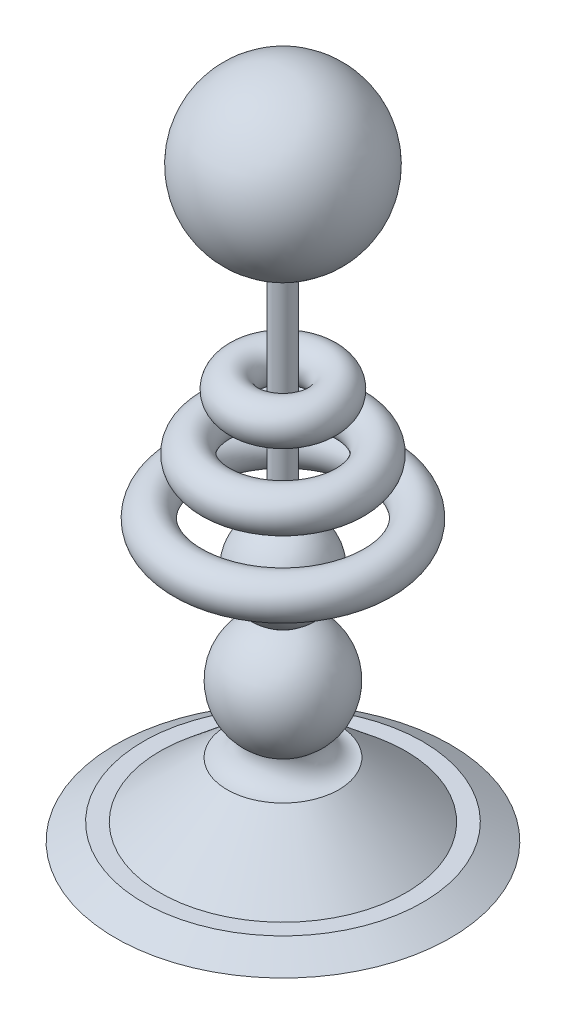
ISO-10303-21;
HEADER;
FILE_DESCRIPTION(('STEP AP214'),'2;1');
FILE_NAME('part.step','',(''),(''),'','','');
FILE_SCHEMA(('AUTOMOTIVE_DESIGN { 1 0 10303 214 1 1 1 1 }'));
ENDSEC;
DATA;
#1=APPLICATION_CONTEXT('core data for automotive mechanical design processes');
#2=APPLICATION_PROTOCOL_DEFINITION('international standard','automotive_design',2000,#1);
#3=PRODUCT_CONTEXT('',#1,'mechanical');
#4=PRODUCT('Part','Part','',(#3));
#5=PRODUCT_RELATED_PRODUCT_CATEGORY('part','',(#4));
#6=PRODUCT_DEFINITION_FORMATION('','',#4);
#7=PRODUCT_DEFINITION_CONTEXT('part definition',#1,'design');
#8=PRODUCT_DEFINITION('design','',#6,#7);
#9=PRODUCT_DEFINITION_SHAPE('','',#8);
#10=(LENGTH_UNIT() NAMED_UNIT(*) SI_UNIT(.MILLI.,.METRE.));
#11=(NAMED_UNIT(*) PLANE_ANGLE_UNIT() SI_UNIT($,.RADIAN.));
#12=(NAMED_UNIT(*) SI_UNIT($,.STERADIAN.) SOLID_ANGLE_UNIT());
#13=UNCERTAINTY_MEASURE_WITH_UNIT(LENGTH_MEASURE(1.E-05),#10,'distance_accuracy_value','');
#14=(GEOMETRIC_REPRESENTATION_CONTEXT(3) GLOBAL_UNCERTAINTY_ASSIGNED_CONTEXT((#13)) GLOBAL_UNIT_ASSIGNED_CONTEXT((#10,
#11,#12)) REPRESENTATION_CONTEXT('',''));
#15=CARTESIAN_POINT('',(0.,0.,0.));
#16=DIRECTION('',(0.,0.,1.));
#17=DIRECTION('',(1.,0.,0.));
#18=AXIS2_PLACEMENT_3D('',#15,#16,#17);
#19=CARTESIAN_POINT('',(0.,50.1339312526815,0.));
#20=DIRECTION('',(0.,-1.,0.));
#21=DIRECTION('',(0.,0.,-1.));
#22=AXIS2_PLACEMENT_3D('',#19,#20,#21);
#23=TOROIDAL_SURFACE('',#22,17.,3.5);
#24=CARTESIAN_POINT('',(0.,50.1339312526815,-20.5));
#25=VERTEX_POINT('',#24);
#26=VERTEX_LOOP('',#25);
#27=FACE_BOUND('',#26,.T.);
#28=ADVANCED_FACE('F43',(#27),#23,.T.);
#29=CLOSED_SHELL('',(#28));
#30=MANIFOLD_SOLID_BREP('B2',#29);
#31=CARTESIAN_POINT('',(0.,60.1339312526815,0.));
#32=DIRECTION('',(0.,-1.,0.));
#33=DIRECTION('',(0.,0.,-1.));
#34=AXIS2_PLACEMENT_3D('',#31,#32,#33);
#35=TOROIDAL_SURFACE('',#34,12.,3.5);
#36=CARTESIAN_POINT('',(0.,60.1339312526815,-15.5));
#37=VERTEX_POINT('',#36);
#38=VERTEX_LOOP('',#37);
#39=FACE_BOUND('',#38,.T.);
#40=ADVANCED_FACE('F63',(#39),#35,.T.);
#41=CLOSED_SHELL('',(#40));
#42=MANIFOLD_SOLID_BREP('B6',#41);
#43=CARTESIAN_POINT('',(0.,70.1339312526815,0.));
#44=DIRECTION('',(0.,-1.,0.));
#45=DIRECTION('',(0.,0.,-1.));
#46=AXIS2_PLACEMENT_3D('',#43,#44,#45);
#47=TOROIDAL_SURFACE('',#46,7.,3.5);
#48=CARTESIAN_POINT('',(0.,70.1339312526815,-10.5));
#49=VERTEX_POINT('',#48);
#50=VERTEX_LOOP('',#49);
#51=FACE_BOUND('',#50,.T.);
#52=ADVANCED_FACE('F84',(#51),#47,.T.);
#53=CLOSED_SHELL('',(#52));
#54=MANIFOLD_SOLID_BREP('B39',#53);
#55=CARTESIAN_POINT('',(0.,0.,0.));
#56=DIRECTION('',(0.,-1.,0.));
#57=DIRECTION('',(0.,0.,-1.));
#58=AXIS2_PLACEMENT_3D('',#55,#56,#57);
#59=PLANE('',#58);
#60=CARTESIAN_POINT('',(0.,0.,0.));
#61=DIRECTION('',(0.,-1.,0.));
#62=DIRECTION('',(0.,0.,-1.));
#63=AXIS2_PLACEMENT_3D('',#60,#61,#62);
#64=CIRCLE('',#63,30.);
#65=CARTESIAN_POINT('',(0.,0.,-30.));
#66=VERTEX_POINT('',#65);
#67=EDGE_CURVE('E83',#66,#66,#64,.T.);
#68=ORIENTED_EDGE('',*,*,#67,.T.);
#69=EDGE_LOOP('',(#68));
#70=FACE_BOUND('',#69,.T.);
#71=ADVANCED_FACE('F98',(#70),#59,.T.);
#72=CARTESIAN_POINT('',(0.,0.,0.));
#73=DIRECTION('',(0.,-1.,0.));
#74=DIRECTION('',(0.,0.,-1.));
#75=AXIS2_PLACEMENT_3D('',#72,#73,#74);
#76=CONICAL_SURFACE('',#75,30.,1.03037682652431);
#77=CARTESIAN_POINT('',(0.,3.,0.));
#78=DIRECTION('',(0.,-1.,0.));
#79=DIRECTION('',(0.,0.,-1.));
#80=AXIS2_PLACEMENT_3D('',#77,#78,#79);
#81=CIRCLE('',#80,25.);
#82=CARTESIAN_POINT('',(0.,3.,-25.));
#83=VERTEX_POINT('',#82);
#84=EDGE_CURVE('E105',#83,#83,#81,.T.);
#85=ORIENTED_EDGE('',*,*,#84,.T.);
#86=EDGE_LOOP('',(#85));
#87=FACE_BOUND('',#86,.T.);
#88=ORIENTED_EDGE('',*,*,#67,.F.);
#89=EDGE_LOOP('',(#88));
#90=FACE_BOUND('',#89,.T.);
#91=ADVANCED_FACE('F145',(#87,#90),#76,.T.);
#92=CARTESIAN_POINT('',(0.,3.,0.));
#93=DIRECTION('',(0.,1.,0.));
#94=DIRECTION('',(0.,0.,1.));
#95=AXIS2_PLACEMENT_3D('',#92,#93,#94);
#96=PLANE('',#95);
#97=CARTESIAN_POINT('',(0.,3.,0.));
#98=DIRECTION('',(0.,-1.,0.));
#99=DIRECTION('',(0.,0.,-1.));
#100=AXIS2_PLACEMENT_3D('',#97,#98,#99);
#101=CIRCLE('',#100,22.);
#102=CARTESIAN_POINT('',(0.,3.,-22.));
#103=VERTEX_POINT('',#102);
#104=EDGE_CURVE('E109',#103,#103,#101,.T.);
#105=ORIENTED_EDGE('',*,*,#104,.T.);
#106=EDGE_LOOP('',(#105));
#107=FACE_BOUND('',#106,.T.);
#108=ORIENTED_EDGE('',*,*,#84,.F.);
#109=EDGE_LOOP('',(#108));
#110=FACE_BOUND('',#109,.T.);
#111=ADVANCED_FACE('F149',(#107,#110),#96,.T.);
#112=CARTESIAN_POINT('',(0.,3.,0.));
#113=DIRECTION('',(0.,-1.,0.));
#114=DIRECTION('',(0.,0.,-1.));
#115=AXIS2_PLACEMENT_3D('',#112,#113,#114);
#116=CONICAL_SURFACE('',#115,22.,0.876058050598193);
#117=CARTESIAN_POINT('',(0.,13.,0.));
#118=DIRECTION('',(0.,-1.,0.));
#119=DIRECTION('',(0.,0.,-1.));
#120=AXIS2_PLACEMENT_3D('',#117,#118,#119);
#121=CIRCLE('',#120,10.);
#122=CARTESIAN_POINT('',(0.,13.,-10.));
#123=VERTEX_POINT('',#122);
#124=EDGE_CURVE('E113',#123,#123,#121,.T.);
#125=ORIENTED_EDGE('',*,*,#124,.T.);
#126=EDGE_LOOP('',(#125));
#127=FACE_BOUND('',#126,.T.);
#128=ORIENTED_EDGE('',*,*,#104,.F.);
#129=EDGE_LOOP('',(#128));
#130=FACE_BOUND('',#129,.T.);
#131=ADVANCED_FACE('F154',(#127,#130),#116,.T.);
#132=CARTESIAN_POINT('',(0.,25.,0.));
#133=DIRECTION('',(0.,-1.,0.));
#134=DIRECTION('',(1.,0.,0.));
#135=AXIS2_PLACEMENT_3D('',#132,#133,#134);
#136=SPHERICAL_SURFACE('',#135,10.);
#137=CARTESIAN_POINT('',(0.,34.7979589711327,0.));
#138=DIRECTION('',(0.,-1.,0.));
#139=DIRECTION('',(0.,0.,-1.));
#140=AXIS2_PLACEMENT_3D('',#137,#138,#139);
#141=CIRCLE('',#140,2.);
#142=CARTESIAN_POINT('',(1.99999999999998,34.7979589711327,0.));
#143=VERTEX_POINT('',#142);
#144=EDGE_CURVE('E121',#143,#143,#141,.T.);
#145=CARTESIAN_POINT('',(0.,17.,0.));
#146=DIRECTION('',(0.,-1.,0.));
#147=DIRECTION('',(0.,0.,-1.));
#148=AXIS2_PLACEMENT_3D('',#145,#146,#147);
#149=CIRCLE('',#148,6.);
#150=CARTESIAN_POINT('',(5.99999999999999,17.,0.));
#151=VERTEX_POINT('',#150);
#152=EDGE_CURVE('E118',#151,#151,#149,.T.);
#153=CARTESIAN_POINT('',(1.99999999999998,34.7979589711327,0.));
#154=CARTESIAN_POINT('',(2.23441364367957,34.7501256550638,0.));
#155=CARTESIAN_POINT('',(2.46710201178148,34.6938501131579,0.));
#156=CARTESIAN_POINT('',(2.92784885341122,34.5647714668555,0.));
#157=CARTESIAN_POINT('',(3.15590732693906,34.4919683624591,0.));
#158=CARTESIAN_POINT('',(3.60621503600195,34.3301914803595,0.));
#159=CARTESIAN_POINT('',(3.828464271537,34.2412177026564,0.));
#160=CARTESIAN_POINT('',(4.26601046169071,34.0475624314351,0.));
#161=CARTESIAN_POINT('',(4.48130741630937,33.942880937917,0.));
#162=CARTESIAN_POINT('',(4.90384008835369,33.7183479637115,0.));
#163=CARTESIAN_POINT('',(5.11107580577935,33.598496483024,0.));
#164=CARTESIAN_POINT('',(5.51641901424601,33.344241012739,0.));
#165=CARTESIAN_POINT('',(5.71452650528701,33.2098370231414,0.));
#166=CARTESIAN_POINT('',(6.10059315143567,32.9271685075426,0.));
#167=CARTESIAN_POINT('',(6.28855230654333,32.7789039815414,0.));
#168=CARTESIAN_POINT('',(6.65335445942644,32.469277853056,0.));
#169=CARTESIAN_POINT('',(6.83019745720188,32.3079162505718,0.));
#170=CARTESIAN_POINT('',(7.17185670386987,31.9729268362496,0.));
#171=CARTESIAN_POINT('',(7.3366729527624,31.7992990244117,0.));
#172=CARTESIAN_POINT('',(7.65343003991436,31.4406712274032,0.));
#173=CARTESIAN_POINT('',(7.80537087817379,31.2556712422326,0.));
#174=CARTESIAN_POINT('',(8.095594778992,30.8752516892526,0.));
#175=CARTESIAN_POINT('',(8.23387784155078,30.6798321214431,0.));
#176=CARTESIAN_POINT('',(8.49607415189474,30.2795796463941,0.));
#177=CARTESIAN_POINT('',(8.61998739967992,30.0747467391546,0.));
#178=CARTESIAN_POINT('',(8.85280603357333,29.6567222989126,0.));
#179=CARTESIAN_POINT('',(8.96171141968156,29.4435307659101,0.));
#180=CARTESIAN_POINT('',(9.16395356093899,29.0098868276024,0.));
#181=CARTESIAN_POINT('',(9.25729031608819,28.7894344222971,0.));
#182=CARTESIAN_POINT('',(9.42791459123193,28.3424038800945,0.));
#183=CARTESIAN_POINT('',(9.50520211122647,28.115825743197,0.));
#184=CARTESIAN_POINT('',(9.643329951655,27.6577104207844,0.));
#185=CARTESIAN_POINT('',(9.704170272089,27.4261732352692,0.));
#186=CARTESIAN_POINT('',(9.8090904379544,26.95933203344,0.));
#187=CARTESIAN_POINT('',(9.8531702833858,26.724028017126,0.));
#188=CARTESIAN_POINT('',(9.92434252586792,26.2508647674639,0.));
#189=CARTESIAN_POINT('',(9.95143492291865,26.013005534116,0.));
#190=CARTESIAN_POINT('',(9.98849276604267,25.5359566213268,0.));
#191=CARTESIAN_POINT('',(9.99845821211596,25.2967669418856,0.));
#192=CARTESIAN_POINT('',(10.0012108397911,24.8182887585038,0.));
#193=CARTESIAN_POINT('',(9.99399802139287,24.5790002545632,0.));
#194=CARTESIAN_POINT('',(9.96243125994404,24.1015565526472,0.));
#195=CARTESIAN_POINT('',(9.93807731689339,23.8634013546718,0.));
#196=CARTESIAN_POINT('',(9.87235370807112,23.389450559563,0.));
#197=CARTESIAN_POINT('',(9.83098404229951,23.1536549624298,0.));
#198=CARTESIAN_POINT('',(9.73144200622672,22.6856375140903,0.));
#199=CARTESIAN_POINT('',(9.67326963592555,22.4534156628841,0.));
#200=CARTESIAN_POINT('',(9.54042172890733,21.9937414492839,0.));
#201=CARTESIAN_POINT('',(9.46574619219028,21.7662890868898,0.));
#202=CARTESIAN_POINT('',(9.30027646605923,21.317325036797,0.));
#203=CARTESIAN_POINT('',(9.20948227664523,21.0958133490982,0.));
#204=CARTESIAN_POINT('',(9.01224276181668,20.6598712382862,0.));
#205=CARTESIAN_POINT('',(8.90579743640212,20.445440815173,0.));
#206=CARTESIAN_POINT('',(8.67780373473756,20.0247653856782,0.));
#207=CARTESIAN_POINT('',(8.55625535848756,19.8185203792967,0.));
#208=CARTESIAN_POINT('',(8.2986814881256,19.4152776953871,0.));
#209=CARTESIAN_POINT('',(8.16265599401364,19.2182800178589,0.));
#210=CARTESIAN_POINT('',(7.8768280668591,18.8345466318875,0.));
#211=CARTESIAN_POINT('',(7.72702563381652,18.6478109234444,0.));
#212=CARTESIAN_POINT('',(7.41441606219272,18.2855619920188,0.));
#213=CARTESIAN_POINT('',(7.2516089236115,18.1100487690363,0.));
#214=CARTESIAN_POINT('',(6.91382497596275,17.7711523289043,0.));
#215=CARTESIAN_POINT('',(6.73884816689522,17.6077691117547,0.));
#216=CARTESIAN_POINT('',(6.3776381072931,17.2939598673956,0.));
#217=CARTESIAN_POINT('',(6.1914048567585,17.143533840186,0.));
#218=CARTESIAN_POINT('',(5.99999999999999,17.,0.));
#219=B_SPLINE_CURVE_WITH_KNOTS('',3,(#153,#154,#155,#156,#157,#158,#159,#160,#161,#162,#163,
#164,#165,#166,#167,#168,#169,#170,#171,#172,#173,#174,#175,#176,#177,#178,#179,#180,#181,#182,
#183,#184,#185,#186,#187,#188,#189,#190,#191,#192,#193,#194,#195,#196,#197,#198,#199,#200,#201,
#202,#203,#204,#205,#206,#207,#208,#209,#210,#211,#212,#213,#214,#215,#216,#217,#218),
.UNSPECIFIED.,.F.,.F.,(4,2,2,2,2,2,2,2,2,2,2,2,2,2,2,2,2,2,2,2,2,2,2,2,2,2,2,2,2,2,2,2,4),(0.,
0.717575214226779,1.43515042845356,2.15272564268034,2.87030085690712,3.5878760711339,
4.30545128536068,5.02302649958746,5.74060171381424,6.45817692804102,7.1757521422678,
7.89332735649458,8.61090257072136,9.32847778494814,10.0460529991749,10.7636282134017,
11.4812034276285,12.1987786418553,12.916353856082,13.6339290703088,14.3515042845356,
15.0690794987624,15.7866547129892,16.5042299272159,17.2218051414427,17.9393803556695,
18.6569555698963,19.3745307841231,20.0921059983498,20.8096812125766,21.5272564268034,
22.2448316410302,22.962406855257),.UNSPECIFIED.);
#220=EDGE_CURVE('BSEAM158',#143,#151,#219,.T.);
#221=ORIENTED_EDGE('',*,*,#144,.T.);
#222=ORIENTED_EDGE('',*,*,#152,.F.);
#223=ORIENTED_EDGE('',*,*,#220,.T.);
#224=ORIENTED_EDGE('',*,*,#220,.F.);
#225=EDGE_LOOP('',(#221,#223,#222,#224));
#226=FACE_BOUND('',#225,.T.);
#227=ADVANCED_FACE('F158',(#226),#136,.T.);
#228=CARTESIAN_POINT('',(0.,42.5439256635475,0.));
#229=DIRECTION('',(0.,-1.,0.));
#230=DIRECTION('',(1.,0.,0.));
#231=AXIS2_PLACEMENT_3D('',#228,#229,#230);
#232=SPHERICAL_SURFACE('',#231,8.);
#233=CARTESIAN_POINT('',(0.,50.2898923559624,0.));
#234=DIRECTION('',(0.,-1.,0.));
#235=DIRECTION('',(0.,0.,-1.));
#236=AXIS2_PLACEMENT_3D('',#233,#234,#235);
#237=CIRCLE('',#236,2.00000000000001);
#238=CARTESIAN_POINT('',(1.99999999999999,50.2898923559624,0.));
#239=VERTEX_POINT('',#238);
#240=EDGE_CURVE('E124',#239,#239,#237,.T.);
#241=CARTESIAN_POINT('',(1.99999999999999,50.2898923559624,0.));
#242=CARTESIAN_POINT('',(2.21271726427572,50.2349916956547,0.));
#243=CARTESIAN_POINT('',(2.42315840874782,50.1712882352115,0.));
#244=CARTESIAN_POINT('',(2.8380928546358,50.0267991967081,0.));
#245=CARTESIAN_POINT('',(3.04258615605167,49.9460136186479,0.));
#246=CARTESIAN_POINT('',(3.4442293123782,49.7678838275642,0.));
#247=CARTESIAN_POINT('',(3.64137916728886,49.6705396145409,0.));
#248=CARTESIAN_POINT('',(4.02700044793937,49.4599594001077,0.));
#249=CARTESIAN_POINT('',(4.21547187367923,49.346723398698,0.));
#250=CARTESIAN_POINT('',(4.58245728250892,49.1051259290963,0.));
#251=CARTESIAN_POINT('',(4.76097126559875,48.9767644609043,0.));
#252=CARTESIAN_POINT('',(5.10683109310295,48.7057872044124,0.));
#253=CARTESIAN_POINT('',(5.27417693751733,48.5631714161125,0.));
#254=CARTESIAN_POINT('',(5.59656533714542,48.2646527558345,0.));
#255=CARTESIAN_POINT('',(5.75160789235912,48.1087498838565,0.));
#256=CARTESIAN_POINT('',(6.04833807197445,47.7847145789569,0.));
#257=CARTESIAN_POINT('',(6.19002569637606,47.6165821460354,0.));
#258=CARTESIAN_POINT('',(6.45908494429743,47.2692281521924,0.));
#259=CARTESIAN_POINT('',(6.58645656781719,47.0900065912708,0.));
#260=CARTESIAN_POINT('',(6.82601985331543,46.7216900033976,0.));
#261=CARTESIAN_POINT('',(6.93821151529392,46.5325949764459,0.));
#262=CARTESIAN_POINT('',(7.14665388163142,46.1458140871067,0.));
#263=CARTESIAN_POINT('',(7.24290458599043,45.9481282247193,0.));
#264=CARTESIAN_POINT('',(7.41881216878633,45.54550656755,0.));
#265=CARTESIAN_POINT('',(7.49846904722323,45.3405707727681,0.));
#266=CARTESIAN_POINT('',(7.64064866568818,44.9248393299095,0.));
#267=CARTESIAN_POINT('',(7.70317140571624,44.7140436818328,0.));
#268=CARTESIAN_POINT('',(7.81065865572902,44.2880223589178,0.));
#269=CARTESIAN_POINT('',(7.85562316571374,44.0727966840797,0.));
#270=CARTESIAN_POINT('',(7.92768896144421,43.6393751830236,0.));
#271=CARTESIAN_POINT('',(7.95479024718995,43.4211793568057,0.));
#272=CARTESIAN_POINT('',(7.99094576646785,42.9832975749077,0.));
#273=CARTESIAN_POINT('',(8.,42.7636116192276,0.));
#274=CARTESIAN_POINT('',(8.,42.3242397078675,0.));
#275=CARTESIAN_POINT('',(7.99094576646786,42.1045537521874,0.));
#276=CARTESIAN_POINT('',(7.95479024718996,41.6666719702895,0.));
#277=CARTESIAN_POINT('',(7.92768896144421,41.4484761440715,0.));
#278=CARTESIAN_POINT('',(7.85562316571375,41.0150546430155,0.));
#279=CARTESIAN_POINT('',(7.81065865572903,40.7998289681773,0.));
#280=CARTESIAN_POINT('',(7.70317140571625,40.3738076452624,0.));
#281=CARTESIAN_POINT('',(7.64064866568819,40.1630119971856,0.));
#282=CARTESIAN_POINT('',(7.49846904722325,39.747280554327,0.));
#283=CARTESIAN_POINT('',(7.41881216878636,39.5423447595452,0.));
#284=CARTESIAN_POINT('',(7.24290458599046,39.1397231023759,0.));
#285=CARTESIAN_POINT('',(7.14665388163144,38.9420372399884,0.));
#286=CARTESIAN_POINT('',(6.93821151529395,38.5552563506493,0.));
#287=CARTESIAN_POINT('',(6.82601985331546,38.3661613236976,0.));
#288=CARTESIAN_POINT('',(6.58645656781722,37.9978447358243,0.));
#289=CARTESIAN_POINT('',(6.45908494429747,37.8186231749027,0.));
#290=CARTESIAN_POINT('',(6.1900256963761,37.4712691810597,0.));
#291=CARTESIAN_POINT('',(6.04833807197449,37.3031367481382,0.));
#292=CARTESIAN_POINT('',(5.75160789235916,36.9791014432387,0.));
#293=CARTESIAN_POINT('',(5.59656533714546,36.8231985712606,0.));
#294=CARTESIAN_POINT('',(5.27417693751737,36.5246799109826,0.));
#295=CARTESIAN_POINT('',(5.106831093103,36.3820641226827,0.));
#296=CARTESIAN_POINT('',(4.76097126559879,36.1110868661908,0.));
#297=CARTESIAN_POINT('',(4.58245728250897,35.9827253979988,0.));
#298=CARTESIAN_POINT('',(4.21547187367928,35.7411279283971,0.));
#299=CARTESIAN_POINT('',(4.02700044793942,35.6278919269874,0.));
#300=CARTESIAN_POINT('',(3.64137916728891,35.4173117125543,0.));
#301=CARTESIAN_POINT('',(3.44422931237825,35.3199674995309,0.));
#302=CARTESIAN_POINT('',(3.04258615605173,35.1418377084472,0.));
#303=CARTESIAN_POINT('',(2.83809285463586,35.061052130387,0.));
#304=CARTESIAN_POINT('',(2.42315840874788,34.9165630918836,0.));
#305=CARTESIAN_POINT('',(2.21271726427577,34.8528596314404,0.));
#306=CARTESIAN_POINT('',(2.00000000000005,34.7979589711327,0.));
#307=B_SPLINE_CURVE_WITH_KNOTS('',3,(#241,#242,#243,#244,#245,#246,#247,#248,#249,#250,#251,
#252,#253,#254,#255,#256,#257,#258,#259,#260,#261,#262,#263,#264,#265,#266,#267,#268,#269,#270,
#271,#272,#273,#274,#275,#276,#277,#278,#279,#280,#281,#282,#283,#284,#285,#286,#287,#288,#289,
#290,#291,#292,#293,#294,#295,#296,#297,#298,#299,#300,#301,#302,#303,#304,#305,#306),
.UNSPECIFIED.,.F.,.F.,(4,2,2,2,2,2,2,2,2,2,2,2,2,2,2,2,2,2,2,2,2,2,2,2,2,2,2,2,2,2,2,2,4),(0.,
0.658871680023909,1.31774336004782,1.97661504007173,2.63548672009563,3.29435840011955,
3.95323008014345,4.61210176016736,5.27097344019127,5.92984512021518,6.58871680023909,
7.247588480263,7.90646016028691,8.56533184031082,9.22420352033473,9.88307520035864,
10.5419468803825,11.2008185604065,11.8596902404304,12.5185619204543,13.1774336004782,
13.8363052805021,14.495176960526,15.1540486405499,15.8129203205738,16.4717920005977,
17.1306636806216,17.7895353606455,18.4484070406695,19.1072787206934,19.7661504007173,
20.4250220807412,21.0838937607651),.UNSPECIFIED.);
#308=EDGE_CURVE('BSEAM141',#239,#143,#307,.T.);
#309=ORIENTED_EDGE('',*,*,#240,.T.);
#310=ORIENTED_EDGE('',*,*,#144,.F.);
#311=ORIENTED_EDGE('',*,*,#308,.T.);
#312=ORIENTED_EDGE('',*,*,#308,.F.);
#313=EDGE_LOOP('',(#309,#311,#310,#312));
#314=FACE_BOUND('',#313,.T.);
#315=ADVANCED_FACE('F141',(#314),#232,.T.);
#316=CARTESIAN_POINT('',(0.,0.,0.));
#317=DIRECTION('',(0.,-1.,0.));
#318=DIRECTION('',(0.,0.,-1.));
#319=AXIS2_PLACEMENT_3D('',#316,#317,#318);
#320=CYLINDRICAL_SURFACE('',#319,2.);
#321=ORIENTED_EDGE('',*,*,#240,.F.);
#322=EDGE_LOOP('',(#321));
#323=FACE_BOUND('',#322,.T.);
#324=CARTESIAN_POINT('',(0.,90.1339312526815,0.));
#325=DIRECTION('',(0.,-1.,0.));
#326=DIRECTION('',(0.,0.,-1.));
#327=AXIS2_PLACEMENT_3D('',#324,#325,#326);
#328=CIRCLE('',#327,2.);
#329=CARTESIAN_POINT('',(0.,90.1339312526815,-2.));
#330=VERTEX_POINT('',#329);
#331=EDGE_CURVE('E127',#330,#330,#328,.T.);
#332=ORIENTED_EDGE('',*,*,#331,.T.);
#333=EDGE_LOOP('',(#332));
#334=FACE_BOUND('',#333,.T.);
#335=ADVANCED_FACE('F131',(#323,#334),#320,.T.);
#336=CARTESIAN_POINT('',(0.,105.,0.));
#337=DIRECTION('',(0.,-1.,0.));
#338=DIRECTION('',(1.,0.,0.));
#339=AXIS2_PLACEMENT_3D('',#336,#337,#338);
#340=SPHERICAL_SURFACE('',#339,15.);
#341=ORIENTED_EDGE('',*,*,#331,.F.);
#342=EDGE_LOOP('',(#341));
#343=FACE_BOUND('',#342,.T.);
#344=ADVANCED_FACE('F133',(#343),#340,.T.);
#345=CARTESIAN_POINT('',(0.,17.,0.));
#346=DIRECTION('',(0.,1.,0.));
#347=DIRECTION('',(0.,0.,1.));
#348=AXIS2_PLACEMENT_3D('',#345,#346,#347);
#349=TOROIDAL_SURFACE('',#348,10.,4.);
#350=ORIENTED_EDGE('',*,*,#152,.T.);
#351=EDGE_LOOP('',(#350));
#352=FACE_BOUND('',#351,.T.);
#353=ORIENTED_EDGE('',*,*,#124,.F.);
#354=EDGE_LOOP('',(#353));
#355=FACE_BOUND('',#354,.T.);
#356=ADVANCED_FACE('F100',(#352,#355),#349,.F.);
#357=CLOSED_SHELL('',(#71,#91,#111,#131,#227,#315,#335,#344,#356));
#358=MANIFOLD_SOLID_BREP('B59',#357);
#359=ADVANCED_BREP_SHAPE_REPRESENTATION('',(#18,#30,#42,#54,#358),#14);
#360=SHAPE_DEFINITION_REPRESENTATION(#9,#359);
ENDSEC;
END-ISO-10303-21;
